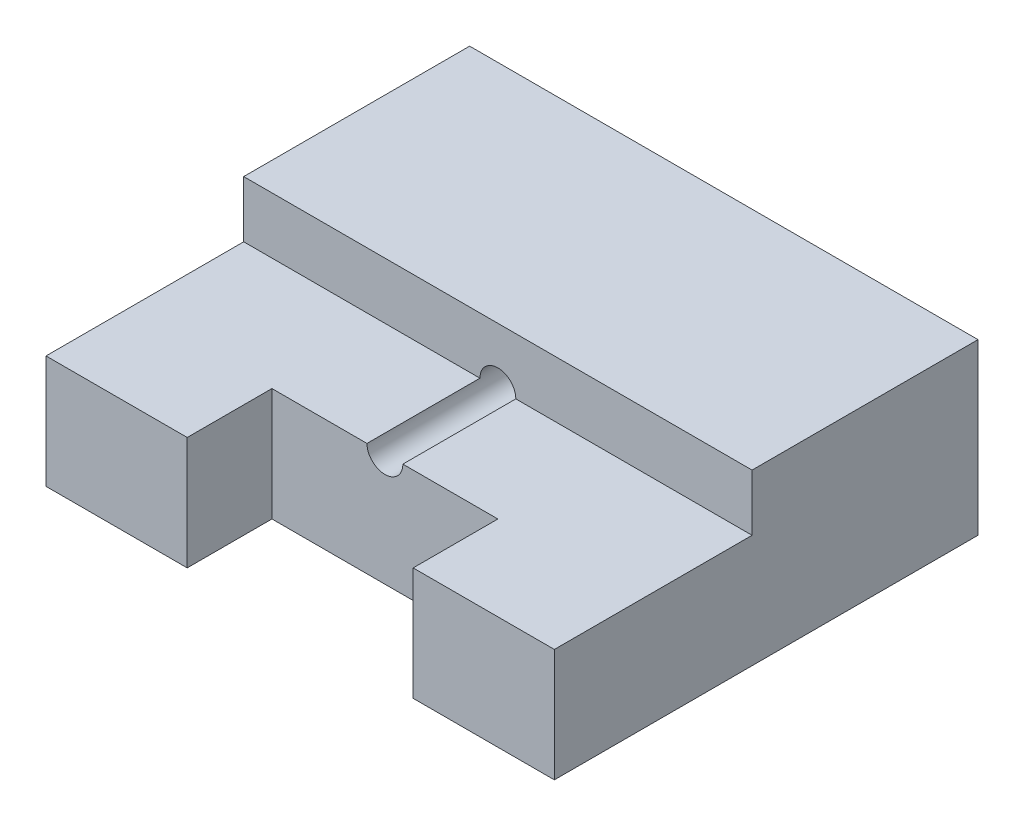
ISO-10303-21;
HEADER;
FILE_DESCRIPTION(('STEP AP214'),'2;1');
FILE_NAME('part.step','',(''),(''),'','','');
FILE_SCHEMA(('AUTOMOTIVE_DESIGN { 1 0 10303 214 1 1 1 1 }'));
ENDSEC;
DATA;
#1=APPLICATION_CONTEXT('core data for automotive mechanical design processes');
#2=APPLICATION_PROTOCOL_DEFINITION('international standard','automotive_design',2000,#1);
#3=PRODUCT_CONTEXT('',#1,'mechanical');
#4=PRODUCT('Part','Part','',(#3));
#5=PRODUCT_RELATED_PRODUCT_CATEGORY('part','',(#4));
#6=PRODUCT_DEFINITION_FORMATION('','',#4);
#7=PRODUCT_DEFINITION_CONTEXT('part definition',#1,'design');
#8=PRODUCT_DEFINITION('design','',#6,#7);
#9=PRODUCT_DEFINITION_SHAPE('','',#8);
#10=(LENGTH_UNIT() NAMED_UNIT(*) SI_UNIT(.MILLI.,.METRE.));
#11=(NAMED_UNIT(*) PLANE_ANGLE_UNIT() SI_UNIT($,.RADIAN.));
#12=(NAMED_UNIT(*) SI_UNIT($,.STERADIAN.) SOLID_ANGLE_UNIT());
#13=UNCERTAINTY_MEASURE_WITH_UNIT(LENGTH_MEASURE(1.E-05),#10,'distance_accuracy_value','');
#14=(GEOMETRIC_REPRESENTATION_CONTEXT(3) GLOBAL_UNCERTAINTY_ASSIGNED_CONTEXT((#13)) GLOBAL_UNIT_ASSIGNED_CONTEXT((#10,
#11,#12)) REPRESENTATION_CONTEXT('',''));
#15=CARTESIAN_POINT('',(0.,0.,0.));
#16=DIRECTION('',(0.,0.,1.));
#17=DIRECTION('',(1.,0.,0.));
#18=AXIS2_PLACEMENT_3D('',#15,#16,#17);
#19=CARTESIAN_POINT('',(0.,4.,0.));
#20=DIRECTION('',(0.,-1.,0.));
#21=DIRECTION('',(0.,0.,-1.));
#22=AXIS2_PLACEMENT_3D('',#19,#20,#21);
#23=PLANE('',#22);
#24=DIRECTION('',(-1.,0.,0.));
#25=VECTOR('',#24,1.);
#26=CARTESIAN_POINT('',(-13.,4.,-3.));
#27=LINE('',#26,#25);
#28=CARTESIAN_POINT('',(-9.635,4.,-3.));
#29=VERTEX_POINT('',#28);
#30=CARTESIAN_POINT('',(-13.,4.,-3.));
#31=VERTEX_POINT('',#30);
#32=EDGE_CURVE('E148',#29,#31,#27,.T.);
#33=ORIENTED_EDGE('',*,*,#32,.F.);
#34=DIRECTION('',(0.,0.,-1.));
#35=VECTOR('',#34,1.);
#36=CARTESIAN_POINT('',(-9.635,4.,0.));
#37=LINE('',#36,#35);
#38=CARTESIAN_POINT('',(-9.635,4.,-7.));
#39=VERTEX_POINT('',#38);
#40=EDGE_CURVE('E55',#29,#39,#37,.T.);
#41=ORIENTED_EDGE('',*,*,#40,.T.);
#42=DIRECTION('',(-1.,0.,0.));
#43=VECTOR('',#42,1.);
#44=CARTESIAN_POINT('',(-2.,4.,-7.));
#45=LINE('',#44,#43);
#46=CARTESIAN_POINT('',(-18.,4.,-7.));
#47=VERTEX_POINT('',#46);
#48=EDGE_CURVE('E184',#39,#47,#45,.T.);
#49=ORIENTED_EDGE('',*,*,#48,.T.);
#50=DIRECTION('',(0.,0.,1.));
#51=VECTOR('',#50,1.);
#52=CARTESIAN_POINT('',(-18.,4.,0.));
#53=LINE('',#52,#51);
#54=CARTESIAN_POINT('',(-18.,4.,0.));
#55=VERTEX_POINT('',#54);
#56=EDGE_CURVE('E173',#47,#55,#53,.T.);
#57=ORIENTED_EDGE('',*,*,#56,.T.);
#58=DIRECTION('',(1.,0.,0.));
#59=VECTOR('',#58,1.);
#60=CARTESIAN_POINT('',(-18.,4.,0.));
#61=LINE('',#60,#59);
#62=CARTESIAN_POINT('',(-13.,4.,0.));
#63=VERTEX_POINT('',#62);
#64=EDGE_CURVE('E177',#55,#63,#61,.T.);
#65=ORIENTED_EDGE('',*,*,#64,.T.);
#66=DIRECTION('',(0.,0.,1.));
#67=VECTOR('',#66,1.);
#68=CARTESIAN_POINT('',(-13.,4.,0.));
#69=LINE('',#68,#67);
#70=EDGE_CURVE('E273',#31,#63,#69,.T.);
#71=ORIENTED_EDGE('',*,*,#70,.F.);
#72=EDGE_LOOP('',(#33,#41,#49,#57,#65,#71));
#73=FACE_BOUND('',#72,.T.);
#74=ADVANCED_FACE('F39',(#73),#23,.F.);
#75=CARTESIAN_POINT('',(0.,6.,0.));
#76=DIRECTION('',(0.,0.,-1.));
#77=DIRECTION('',(-1.,0.,0.));
#78=AXIS2_PLACEMENT_3D('',#75,#76,#77);
#79=PLANE('',#78);
#80=DIRECTION('',(1.,0.,0.));
#81=VECTOR('',#80,1.);
#82=CARTESIAN_POINT('',(0.,0.,0.));
#83=LINE('',#82,#81);
#84=CARTESIAN_POINT('',(-18.,0.,0.));
#85=VERTEX_POINT('',#84);
#86=CARTESIAN_POINT('',(-13.,0.,0.));
#87=VERTEX_POINT('',#86);
#88=EDGE_CURVE('E201',#85,#87,#83,.T.);
#89=ORIENTED_EDGE('',*,*,#88,.T.);
#90=DIRECTION('',(0.,1.,0.));
#91=VECTOR('',#90,1.);
#92=CARTESIAN_POINT('',(-13.,0.,0.));
#93=LINE('',#92,#91);
#94=EDGE_CURVE('E168',#87,#63,#93,.T.);
#95=ORIENTED_EDGE('',*,*,#94,.T.);
#96=ORIENTED_EDGE('',*,*,#64,.F.);
#97=DIRECTION('',(0.,-1.,0.));
#98=VECTOR('',#97,1.);
#99=CARTESIAN_POINT('',(-18.,6.,0.));
#100=LINE('',#99,#98);
#101=EDGE_CURVE('E226',#55,#85,#100,.T.);
#102=ORIENTED_EDGE('',*,*,#101,.T.);
#103=EDGE_LOOP('',(#89,#95,#96,#102));
#104=FACE_BOUND('',#103,.T.);
#105=ADVANCED_FACE('F294',(#104),#79,.F.);
#106=CARTESIAN_POINT('',(0.,6.,0.));
#107=DIRECTION('',(-1.,0.,0.));
#108=DIRECTION('',(0.,0.,1.));
#109=AXIS2_PLACEMENT_3D('',#106,#107,#108);
#110=PLANE('',#109);
#111=DIRECTION('',(0.,0.,-1.));
#112=VECTOR('',#111,1.);
#113=CARTESIAN_POINT('',(0.,6.,0.));
#114=LINE('',#113,#112);
#115=CARTESIAN_POINT('',(0.,6.,-7.));
#116=VERTEX_POINT('',#115);
#117=CARTESIAN_POINT('',(0.,6.,-15.));
#118=VERTEX_POINT('',#117);
#119=EDGE_CURVE('E197',#116,#118,#114,.T.);
#120=ORIENTED_EDGE('',*,*,#119,.F.);
#121=DIRECTION('',(0.,1.,0.));
#122=VECTOR('',#121,1.);
#123=CARTESIAN_POINT('',(0.,4.,-7.));
#124=LINE('',#123,#122);
#125=CARTESIAN_POINT('',(0.,4.,-7.));
#126=VERTEX_POINT('',#125);
#127=EDGE_CURVE('E187',#126,#116,#124,.T.);
#128=ORIENTED_EDGE('',*,*,#127,.F.);
#129=DIRECTION('',(0.,0.,-1.));
#130=VECTOR('',#129,1.);
#131=CARTESIAN_POINT('',(0.,4.,-7.));
#132=LINE('',#131,#130);
#133=CARTESIAN_POINT('',(0.,4.,0.));
#134=VERTEX_POINT('',#133);
#135=EDGE_CURVE('E181',#134,#126,#132,.T.);
#136=ORIENTED_EDGE('',*,*,#135,.F.);
#137=DIRECTION('',(0.,-1.,0.));
#138=VECTOR('',#137,1.);
#139=CARTESIAN_POINT('',(0.,6.,0.));
#140=LINE('',#139,#138);
#141=CARTESIAN_POINT('',(0.,0.,0.));
#142=VERTEX_POINT('',#141);
#143=EDGE_CURVE('E208',#134,#142,#140,.T.);
#144=ORIENTED_EDGE('',*,*,#143,.T.);
#145=DIRECTION('',(0.,0.,-1.));
#146=VECTOR('',#145,1.);
#147=CARTESIAN_POINT('',(0.,0.,0.));
#148=LINE('',#147,#146);
#149=CARTESIAN_POINT('',(0.,0.,-15.));
#150=VERTEX_POINT('',#149);
#151=EDGE_CURVE('E194',#142,#150,#148,.T.);
#152=ORIENTED_EDGE('',*,*,#151,.T.);
#153=DIRECTION('',(0.,-1.,0.));
#154=VECTOR('',#153,1.);
#155=CARTESIAN_POINT('',(0.,6.,-15.));
#156=LINE('',#155,#154);
#157=EDGE_CURVE('E48',#118,#150,#156,.T.);
#158=ORIENTED_EDGE('',*,*,#157,.F.);
#159=EDGE_LOOP('',(#120,#128,#136,#144,#152,#158));
#160=FACE_BOUND('',#159,.T.);
#161=ADVANCED_FACE('F41',(#160),#110,.F.);
#162=CARTESIAN_POINT('',(0.,6.,-15.));
#163=DIRECTION('',(0.,0.,1.));
#164=DIRECTION('',(1.,0.,0.));
#165=AXIS2_PLACEMENT_3D('',#162,#163,#164);
#166=PLANE('',#165);
#167=CARTESIAN_POINT('',(-9.,4.,-15.));
#168=DIRECTION('',(0.,0.,-1.));
#169=DIRECTION('',(-1.,0.,0.));
#170=AXIS2_PLACEMENT_3D('',#167,#168,#169);
#171=CIRCLE('',#170,0.635000000000001);
#172=CARTESIAN_POINT('',(-9.635,4.,-15.));
#173=VERTEX_POINT('',#172);
#174=EDGE_CURVE('E141',#173,#173,#171,.T.);
#175=ORIENTED_EDGE('',*,*,#174,.F.);
#176=EDGE_LOOP('',(#175));
#177=FACE_BOUND('',#176,.T.);
#178=DIRECTION('',(-1.,0.,0.));
#179=VECTOR('',#178,1.);
#180=CARTESIAN_POINT('',(0.,0.,-15.));
#181=LINE('',#180,#179);
#182=CARTESIAN_POINT('',(-18.,0.,-15.));
#183=VERTEX_POINT('',#182);
#184=EDGE_CURVE('E212',#150,#183,#181,.T.);
#185=ORIENTED_EDGE('',*,*,#184,.T.);
#186=DIRECTION('',(0.,-1.,0.));
#187=VECTOR('',#186,1.);
#188=CARTESIAN_POINT('',(-18.,6.,-15.));
#189=LINE('',#188,#187);
#190=CARTESIAN_POINT('',(-18.,6.,-15.));
#191=VERTEX_POINT('',#190);
#192=EDGE_CURVE('E229',#191,#183,#189,.T.);
#193=ORIENTED_EDGE('',*,*,#192,.F.);
#194=DIRECTION('',(-1.,0.,0.));
#195=VECTOR('',#194,1.);
#196=CARTESIAN_POINT('',(0.,6.,-15.));
#197=LINE('',#196,#195);
#198=EDGE_CURVE('E200',#118,#191,#197,.T.);
#199=ORIENTED_EDGE('',*,*,#198,.F.);
#200=ORIENTED_EDGE('',*,*,#157,.T.);
#201=EDGE_LOOP('',(#185,#193,#199,#200));
#202=FACE_BOUND('',#201,.T.);
#203=ADVANCED_FACE('F237',(#177,#202),#166,.F.);
#204=CARTESIAN_POINT('',(-18.,6.,0.));
#205=DIRECTION('',(1.,0.,0.));
#206=DIRECTION('',(0.,0.,-1.));
#207=AXIS2_PLACEMENT_3D('',#204,#205,#206);
#208=PLANE('',#207);
#209=ORIENTED_EDGE('',*,*,#56,.F.);
#210=DIRECTION('',(0.,1.,0.));
#211=VECTOR('',#210,1.);
#212=CARTESIAN_POINT('',(-18.,4.,-7.));
#213=LINE('',#212,#211);
#214=CARTESIAN_POINT('',(-18.,6.,-7.));
#215=VERTEX_POINT('',#214);
#216=EDGE_CURVE('E190',#47,#215,#213,.T.);
#217=ORIENTED_EDGE('',*,*,#216,.T.);
#218=DIRECTION('',(0.,0.,1.));
#219=VECTOR('',#218,1.);
#220=CARTESIAN_POINT('',(-18.,6.,0.));
#221=LINE('',#220,#219);
#222=EDGE_CURVE('E204',#191,#215,#221,.T.);
#223=ORIENTED_EDGE('',*,*,#222,.F.);
#224=ORIENTED_EDGE('',*,*,#192,.T.);
#225=DIRECTION('',(0.,0.,1.));
#226=VECTOR('',#225,1.);
#227=CARTESIAN_POINT('',(-18.,0.,0.));
#228=LINE('',#227,#226);
#229=EDGE_CURVE('E215',#183,#85,#228,.T.);
#230=ORIENTED_EDGE('',*,*,#229,.T.);
#231=ORIENTED_EDGE('',*,*,#101,.F.);
#232=EDGE_LOOP('',(#209,#217,#223,#224,#230,#231));
#233=FACE_BOUND('',#232,.T.);
#234=ADVANCED_FACE('F254',(#233),#208,.F.);
#235=CARTESIAN_POINT('',(-5.00000000000001,4.,0.));
#236=VERTEX_POINT('',#235);
#237=EDGE_CURVE('E176',#236,#134,#61,.T.);
#238=ORIENTED_EDGE('',*,*,#237,.F.);
#239=DIRECTION('',(0.,1.,0.));
#240=VECTOR('',#239,1.);
#241=CARTESIAN_POINT('',(-5.00000000000001,0.,0.));
#242=LINE('',#241,#240);
#243=CARTESIAN_POINT('',(-5.00000000000001,0.,0.));
#244=VERTEX_POINT('',#243);
#245=EDGE_CURVE('E62',#244,#236,#242,.T.);
#246=ORIENTED_EDGE('',*,*,#245,.F.);
#247=EDGE_CURVE('E219',#244,#142,#83,.T.);
#248=ORIENTED_EDGE('',*,*,#247,.T.);
#249=ORIENTED_EDGE('',*,*,#143,.F.);
#250=EDGE_LOOP('',(#238,#246,#248,#249));
#251=FACE_BOUND('',#250,.T.);
#252=ADVANCED_FACE('F292',(#251),#79,.F.);
#253=CARTESIAN_POINT('',(0.,6.,0.));
#254=DIRECTION('',(0.,1.,0.));
#255=DIRECTION('',(0.,0.,1.));
#256=AXIS2_PLACEMENT_3D('',#253,#254,#255);
#257=PLANE('',#256);
#258=DIRECTION('',(-1.,0.,0.));
#259=VECTOR('',#258,1.);
#260=CARTESIAN_POINT('',(-18.,6.,-7.));
#261=LINE('',#260,#259);
#262=EDGE_CURVE('E163',#116,#215,#261,.T.);
#263=ORIENTED_EDGE('',*,*,#262,.F.);
#264=ORIENTED_EDGE('',*,*,#119,.T.);
#265=ORIENTED_EDGE('',*,*,#198,.T.);
#266=ORIENTED_EDGE('',*,*,#222,.T.);
#267=EDGE_LOOP('',(#263,#264,#265,#266));
#268=FACE_BOUND('',#267,.T.);
#269=ADVANCED_FACE('F259',(#268),#257,.T.);
#270=CARTESIAN_POINT('',(0.,0.,0.));
#271=DIRECTION('',(0.,1.,0.));
#272=DIRECTION('',(0.,0.,1.));
#273=AXIS2_PLACEMENT_3D('',#270,#271,#272);
#274=PLANE('',#273);
#275=DIRECTION('',(-1.,0.,0.));
#276=VECTOR('',#275,1.);
#277=CARTESIAN_POINT('',(-13.,0.,-3.));
#278=LINE('',#277,#276);
#279=CARTESIAN_POINT('',(-5.00000000000001,0.,-3.));
#280=VERTEX_POINT('',#279);
#281=CARTESIAN_POINT('',(-13.,0.,-3.));
#282=VERTEX_POINT('',#281);
#283=EDGE_CURVE('E172',#280,#282,#278,.T.);
#284=ORIENTED_EDGE('',*,*,#283,.T.);
#285=DIRECTION('',(0.,0.,1.));
#286=VECTOR('',#285,1.);
#287=CARTESIAN_POINT('',(-13.,0.,0.));
#288=LINE('',#287,#286);
#289=EDGE_CURVE('E147',#282,#87,#288,.T.);
#290=ORIENTED_EDGE('',*,*,#289,.T.);
#291=ORIENTED_EDGE('',*,*,#88,.F.);
#292=ORIENTED_EDGE('',*,*,#229,.F.);
#293=ORIENTED_EDGE('',*,*,#184,.F.);
#294=ORIENTED_EDGE('',*,*,#151,.F.);
#295=ORIENTED_EDGE('',*,*,#247,.F.);
#296=DIRECTION('',(0.,0.,-1.));
#297=VECTOR('',#296,1.);
#298=CARTESIAN_POINT('',(-5.00000000000001,0.,0.));
#299=LINE('',#298,#297);
#300=EDGE_CURVE('E153',#244,#280,#299,.T.);
#301=ORIENTED_EDGE('',*,*,#300,.T.);
#302=EDGE_LOOP('',(#284,#290,#291,#292,#293,#294,#295,#301));
#303=FACE_BOUND('',#302,.T.);
#304=ADVANCED_FACE('F247',(#303),#274,.F.);
#305=CARTESIAN_POINT('',(-18.,4.,-7.));
#306=DIRECTION('',(0.,0.,-1.));
#307=DIRECTION('',(-1.,0.,0.));
#308=AXIS2_PLACEMENT_3D('',#305,#306,#307);
#309=PLANE('',#308);
#310=ORIENTED_EDGE('',*,*,#48,.F.);
#311=CARTESIAN_POINT('',(-9.,4.,-7.));
#312=DIRECTION('',(0.,0.,-1.));
#313=DIRECTION('',(-1.,0.,0.));
#314=AXIS2_PLACEMENT_3D('',#311,#312,#313);
#315=CIRCLE('',#314,0.635000000000001);
#316=CARTESIAN_POINT('',(-8.365,4.,-7.));
#317=VERTEX_POINT('',#316);
#318=EDGE_CURVE('E264',#39,#317,#315,.T.);
#319=ORIENTED_EDGE('',*,*,#318,.T.);
#320=EDGE_CURVE('E139',#126,#317,#45,.T.);
#321=ORIENTED_EDGE('',*,*,#320,.F.);
#322=ORIENTED_EDGE('',*,*,#127,.T.);
#323=ORIENTED_EDGE('',*,*,#262,.T.);
#324=ORIENTED_EDGE('',*,*,#216,.F.);
#325=EDGE_LOOP('',(#310,#319,#321,#322,#323,#324));
#326=FACE_BOUND('',#325,.T.);
#327=ADVANCED_FACE('F263',(#326),#309,.F.);
#328=ORIENTED_EDGE('',*,*,#320,.T.);
#329=DIRECTION('',(0.,0.,-1.));
#330=VECTOR('',#329,1.);
#331=CARTESIAN_POINT('',(-8.365,4.,0.));
#332=LINE('',#331,#330);
#333=CARTESIAN_POINT('',(-8.365,4.,-3.));
#334=VERTEX_POINT('',#333);
#335=EDGE_CURVE('E128',#317,#334,#332,.F.);
#336=ORIENTED_EDGE('',*,*,#335,.T.);
#337=CARTESIAN_POINT('',(-5.00000000000001,4.,-3.));
#338=VERTEX_POINT('',#337);
#339=EDGE_CURVE('E137',#338,#334,#27,.T.);
#340=ORIENTED_EDGE('',*,*,#339,.F.);
#341=DIRECTION('',(0.,0.,-1.));
#342=VECTOR('',#341,1.);
#343=CARTESIAN_POINT('',(-5.00000000000001,4.,0.));
#344=LINE('',#343,#342);
#345=EDGE_CURVE('E155',#236,#338,#344,.T.);
#346=ORIENTED_EDGE('',*,*,#345,.F.);
#347=ORIENTED_EDGE('',*,*,#237,.T.);
#348=ORIENTED_EDGE('',*,*,#135,.T.);
#349=EDGE_LOOP('',(#328,#336,#340,#346,#347,#348));
#350=FACE_BOUND('',#349,.T.);
#351=ADVANCED_FACE('F136',(#350),#23,.F.);
#352=CARTESIAN_POINT('',(-13.,0.,0.));
#353=DIRECTION('',(-1.,0.,0.));
#354=DIRECTION('',(0.,0.,1.));
#355=AXIS2_PLACEMENT_3D('',#352,#353,#354);
#356=PLANE('',#355);
#357=ORIENTED_EDGE('',*,*,#70,.T.);
#358=ORIENTED_EDGE('',*,*,#94,.F.);
#359=ORIENTED_EDGE('',*,*,#289,.F.);
#360=DIRECTION('',(0.,1.,0.));
#361=VECTOR('',#360,1.);
#362=CARTESIAN_POINT('',(-13.,0.,-3.));
#363=LINE('',#362,#361);
#364=EDGE_CURVE('E159',#282,#31,#363,.T.);
#365=ORIENTED_EDGE('',*,*,#364,.T.);
#366=EDGE_LOOP('',(#357,#358,#359,#365));
#367=FACE_BOUND('',#366,.T.);
#368=ADVANCED_FACE('F306',(#367),#356,.F.);
#369=CARTESIAN_POINT('',(-13.,0.,-3.));
#370=DIRECTION('',(0.,0.,-1.));
#371=DIRECTION('',(-1.,0.,0.));
#372=AXIS2_PLACEMENT_3D('',#369,#370,#371);
#373=PLANE('',#372);
#374=ORIENTED_EDGE('',*,*,#339,.T.);
#375=CARTESIAN_POINT('',(-9.,4.,-3.));
#376=DIRECTION('',(0.,0.,-1.));
#377=DIRECTION('',(-1.,0.,0.));
#378=AXIS2_PLACEMENT_3D('',#375,#376,#377);
#379=CIRCLE('',#378,0.635000000000001);
#380=EDGE_CURVE('E11',#334,#29,#379,.T.);
#381=ORIENTED_EDGE('',*,*,#380,.T.);
#382=ORIENTED_EDGE('',*,*,#32,.T.);
#383=ORIENTED_EDGE('',*,*,#364,.F.);
#384=ORIENTED_EDGE('',*,*,#283,.F.);
#385=DIRECTION('',(0.,1.,0.));
#386=VECTOR('',#385,1.);
#387=CARTESIAN_POINT('',(-5.00000000000001,0.,-3.));
#388=LINE('',#387,#386);
#389=EDGE_CURVE('E145',#280,#338,#388,.T.);
#390=ORIENTED_EDGE('',*,*,#389,.T.);
#391=EDGE_LOOP('',(#374,#381,#382,#383,#384,#390));
#392=FACE_BOUND('',#391,.T.);
#393=ADVANCED_FACE('F143',(#392),#373,.F.);
#394=CARTESIAN_POINT('',(-5.00000000000001,0.,0.));
#395=DIRECTION('',(1.,0.,0.));
#396=DIRECTION('',(0.,0.,-1.));
#397=AXIS2_PLACEMENT_3D('',#394,#395,#396);
#398=PLANE('',#397);
#399=ORIENTED_EDGE('',*,*,#345,.T.);
#400=ORIENTED_EDGE('',*,*,#389,.F.);
#401=ORIENTED_EDGE('',*,*,#300,.F.);
#402=ORIENTED_EDGE('',*,*,#245,.T.);
#403=EDGE_LOOP('',(#399,#400,#401,#402));
#404=FACE_BOUND('',#403,.T.);
#405=ADVANCED_FACE('F346',(#404),#398,.F.);
#406=CARTESIAN_POINT('',(-9.,4.,0.));
#407=DIRECTION('',(0.,0.,-1.));
#408=DIRECTION('',(-1.,0.,0.));
#409=AXIS2_PLACEMENT_3D('',#406,#407,#408);
#410=CYLINDRICAL_SURFACE('',#409,0.635000000000001);
#411=ORIENTED_EDGE('',*,*,#174,.T.);
#412=EDGE_LOOP('',(#411));
#413=FACE_BOUND('',#412,.T.);
#414=ORIENTED_EDGE('',*,*,#40,.F.);
#415=ORIENTED_EDGE('',*,*,#380,.F.);
#416=ORIENTED_EDGE('',*,*,#335,.F.);
#417=ORIENTED_EDGE('',*,*,#318,.F.);
#418=EDGE_LOOP('',(#414,#415,#416,#417));
#419=FACE_BOUND('',#418,.T.);
#420=ADVANCED_FACE('F127',(#413,#419),#410,.F.);
#421=CLOSED_SHELL('',(#74,#105,#161,#203,#234,#252,#269,#304,#327,#351,#368,#393,#405,#420));
#422=MANIFOLD_SOLID_BREP('B2',#421);
#423=ADVANCED_BREP_SHAPE_REPRESENTATION('',(#18,#422),#14);
#424=SHAPE_DEFINITION_REPRESENTATION(#9,#423);
ENDSEC;
END-ISO-10303-21;
